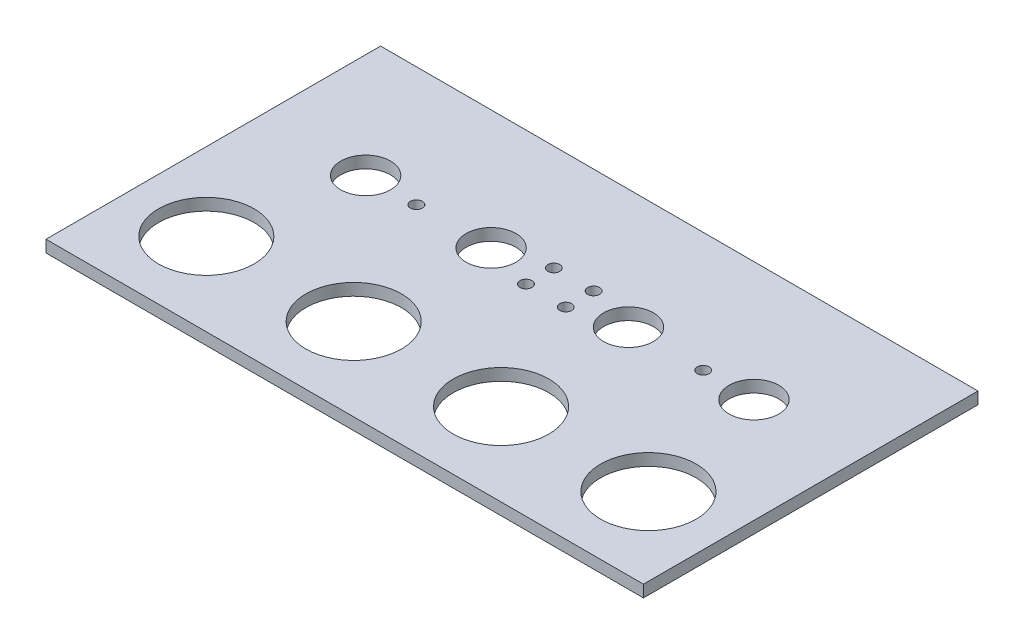
ISO-10303-21;
HEADER;
FILE_DESCRIPTION(('STEP AP214'),'2;1');
FILE_NAME('part.step','',(''),(''),'','','');
FILE_SCHEMA(('AUTOMOTIVE_DESIGN { 1 0 10303 214 1 1 1 1 }'));
ENDSEC;
DATA;
#1=APPLICATION_CONTEXT('core data for automotive mechanical design processes');
#2=APPLICATION_PROTOCOL_DEFINITION('international standard','automotive_design',2000,#1);
#3=PRODUCT_CONTEXT('',#1,'mechanical');
#4=PRODUCT('Part','Part','',(#3));
#5=PRODUCT_RELATED_PRODUCT_CATEGORY('part','',(#4));
#6=PRODUCT_DEFINITION_FORMATION('','',#4);
#7=PRODUCT_DEFINITION_CONTEXT('part definition',#1,'design');
#8=PRODUCT_DEFINITION('design','',#6,#7);
#9=PRODUCT_DEFINITION_SHAPE('','',#8);
#10=(LENGTH_UNIT() NAMED_UNIT(*) SI_UNIT(.MILLI.,.METRE.));
#11=(NAMED_UNIT(*) PLANE_ANGLE_UNIT() SI_UNIT($,.RADIAN.));
#12=(NAMED_UNIT(*) SI_UNIT($,.STERADIAN.) SOLID_ANGLE_UNIT());
#13=UNCERTAINTY_MEASURE_WITH_UNIT(LENGTH_MEASURE(1.E-05),#10,'distance_accuracy_value','');
#14=(GEOMETRIC_REPRESENTATION_CONTEXT(3) GLOBAL_UNCERTAINTY_ASSIGNED_CONTEXT((#13)) GLOBAL_UNIT_ASSIGNED_CONTEXT((#10,
#11,#12)) REPRESENTATION_CONTEXT('',''));
#15=CARTESIAN_POINT('',(0.,0.,0.));
#16=DIRECTION('',(0.,0.,1.));
#17=DIRECTION('',(1.,0.,0.));
#18=AXIS2_PLACEMENT_3D('',#15,#16,#17);
#19=CARTESIAN_POINT('',(-60.5686566500887,-3.,-45.286639095357));
#20=DIRECTION('',(-1.,0.,0.));
#21=DIRECTION('',(0.,0.,1.));
#22=AXIS2_PLACEMENT_3D('',#19,#20,#21);
#23=PLANE('',#22);
#24=DIRECTION('',(0.,0.,1.));
#25=VECTOR('',#24,1.);
#26=CARTESIAN_POINT('',(-60.5686566500887,0.,-45.286639095357));
#27=LINE('',#26,#25);
#28=CARTESIAN_POINT('',(-60.5686566500887,0.,-45.286639095357));
#29=VERTEX_POINT('',#28);
#30=CARTESIAN_POINT('',(-60.5686566500886,0.,38.713360904643));
#31=VERTEX_POINT('',#30);
#32=EDGE_CURVE('E104',#29,#31,#27,.T.);
#33=ORIENTED_EDGE('',*,*,#32,.F.);
#34=DIRECTION('',(0.,1.,0.));
#35=VECTOR('',#34,1.);
#36=CARTESIAN_POINT('',(-60.5686566500887,-3.,-45.286639095357));
#37=LINE('',#36,#35);
#38=CARTESIAN_POINT('',(-60.5686566500887,-3.,-45.286639095357));
#39=VERTEX_POINT('',#38);
#40=EDGE_CURVE('E11',#39,#29,#37,.T.);
#41=ORIENTED_EDGE('',*,*,#40,.F.);
#42=DIRECTION('',(0.,0.,1.));
#43=VECTOR('',#42,1.);
#44=CARTESIAN_POINT('',(-60.5686566500887,-3.,-45.286639095357));
#45=LINE('',#44,#43);
#46=CARTESIAN_POINT('',(-60.5686566500886,-3.,38.713360904643));
#47=VERTEX_POINT('',#46);
#48=EDGE_CURVE('E97',#39,#47,#45,.T.);
#49=ORIENTED_EDGE('',*,*,#48,.T.);
#50=DIRECTION('',(0.,1.,0.));
#51=VECTOR('',#50,1.);
#52=CARTESIAN_POINT('',(-60.5686566500886,-3.,38.713360904643));
#53=LINE('',#52,#51);
#54=EDGE_CURVE('E42',#47,#31,#53,.T.);
#55=ORIENTED_EDGE('',*,*,#54,.T.);
#56=EDGE_LOOP('',(#33,#41,#49,#55));
#57=FACE_BOUND('',#56,.T.);
#58=ADVANCED_FACE('F39',(#57),#23,.T.);
#59=CARTESIAN_POINT('',(-60.5686566500887,-3.,-45.286639095357));
#60=DIRECTION('',(0.,0.,-1.));
#61=DIRECTION('',(-1.,0.,0.));
#62=AXIS2_PLACEMENT_3D('',#59,#60,#61);
#63=PLANE('',#62);
#64=DIRECTION('',(-1.,0.,0.));
#65=VECTOR('',#64,1.);
#66=CARTESIAN_POINT('',(-60.5686566500887,0.,-45.286639095357));
#67=LINE('',#66,#65);
#68=CARTESIAN_POINT('',(89.4313433499113,0.,-45.286639095357));
#69=VERTEX_POINT('',#68);
#70=EDGE_CURVE('E99',#69,#29,#67,.T.);
#71=ORIENTED_EDGE('',*,*,#70,.F.);
#72=DIRECTION('',(0.,1.,0.));
#73=VECTOR('',#72,1.);
#74=CARTESIAN_POINT('',(89.4313433499113,-3.,-45.286639095357));
#75=LINE('',#74,#73);
#76=CARTESIAN_POINT('',(89.4313433499113,-3.,-45.286639095357));
#77=VERTEX_POINT('',#76);
#78=EDGE_CURVE('E48',#77,#69,#75,.T.);
#79=ORIENTED_EDGE('',*,*,#78,.F.);
#80=DIRECTION('',(-1.,0.,0.));
#81=VECTOR('',#80,1.);
#82=CARTESIAN_POINT('',(-60.5686566500887,-3.,-45.286639095357));
#83=LINE('',#82,#81);
#84=EDGE_CURVE('E94',#77,#39,#83,.T.);
#85=ORIENTED_EDGE('',*,*,#84,.T.);
#86=ORIENTED_EDGE('',*,*,#40,.T.);
#87=EDGE_LOOP('',(#71,#79,#85,#86));
#88=FACE_BOUND('',#87,.T.);
#89=ADVANCED_FACE('F115',(#88),#63,.T.);
#90=CARTESIAN_POINT('',(89.4313433499113,-3.,-45.286639095357));
#91=DIRECTION('',(1.,0.,0.));
#92=DIRECTION('',(0.,0.,-1.));
#93=AXIS2_PLACEMENT_3D('',#90,#91,#92);
#94=PLANE('',#93);
#95=DIRECTION('',(0.,0.,-1.));
#96=VECTOR('',#95,1.);
#97=CARTESIAN_POINT('',(89.4313433499113,0.,-45.286639095357));
#98=LINE('',#97,#96);
#99=CARTESIAN_POINT('',(89.4313433499113,0.,38.713360904643));
#100=VERTEX_POINT('',#99);
#101=EDGE_CURVE('E89',#100,#69,#98,.T.);
#102=ORIENTED_EDGE('',*,*,#101,.F.);
#103=DIRECTION('',(0.,1.,0.));
#104=VECTOR('',#103,1.);
#105=CARTESIAN_POINT('',(89.4313433499113,-3.,38.713360904643));
#106=LINE('',#105,#104);
#107=CARTESIAN_POINT('',(89.4313433499113,-3.,38.713360904643));
#108=VERTEX_POINT('',#107);
#109=EDGE_CURVE('E84',#108,#100,#106,.T.);
#110=ORIENTED_EDGE('',*,*,#109,.F.);
#111=DIRECTION('',(0.,0.,-1.));
#112=VECTOR('',#111,1.);
#113=CARTESIAN_POINT('',(89.4313433499113,-3.,-45.286639095357));
#114=LINE('',#113,#112);
#115=EDGE_CURVE('E87',#108,#77,#114,.T.);
#116=ORIENTED_EDGE('',*,*,#115,.T.);
#117=ORIENTED_EDGE('',*,*,#78,.T.);
#118=EDGE_LOOP('',(#102,#110,#116,#117));
#119=FACE_BOUND('',#118,.T.);
#120=ADVANCED_FACE('F86',(#119),#94,.T.);
#121=CARTESIAN_POINT('',(-60.5686566500886,-3.,38.713360904643));
#122=DIRECTION('',(0.,0.,1.));
#123=DIRECTION('',(1.,0.,0.));
#124=AXIS2_PLACEMENT_3D('',#121,#122,#123);
#125=PLANE('',#124);
#126=DIRECTION('',(1.,0.,0.));
#127=VECTOR('',#126,1.);
#128=CARTESIAN_POINT('',(-60.5686566500886,0.,38.713360904643));
#129=LINE('',#128,#127);
#130=EDGE_CURVE('E107',#31,#100,#129,.T.);
#131=ORIENTED_EDGE('',*,*,#130,.F.);
#132=ORIENTED_EDGE('',*,*,#54,.F.);
#133=DIRECTION('',(1.,0.,0.));
#134=VECTOR('',#133,1.);
#135=CARTESIAN_POINT('',(-60.5686566500886,-3.,38.713360904643));
#136=LINE('',#135,#134);
#137=EDGE_CURVE('E93',#47,#108,#136,.T.);
#138=ORIENTED_EDGE('',*,*,#137,.T.);
#139=ORIENTED_EDGE('',*,*,#109,.T.);
#140=EDGE_LOOP('',(#131,#132,#138,#139));
#141=FACE_BOUND('',#140,.T.);
#142=ADVANCED_FACE('F96',(#141),#125,.T.);
#143=CARTESIAN_POINT('',(0.,-3.,0.));
#144=DIRECTION('',(0.,1.,0.));
#145=DIRECTION('',(0.,0.,1.));
#146=AXIS2_PLACEMENT_3D('',#143,#144,#145);
#147=PLANE('',#146);
#148=CARTESIAN_POINT('',(63.1813433499114,-3.,-15.286639095357));
#149=DIRECTION('',(0.,1.,0.));
#150=DIRECTION('',(0.,0.,-1.));
#151=AXIS2_PLACEMENT_3D('',#148,#149,#150);
#152=CIRCLE('',#151,6.25);
#153=CARTESIAN_POINT('',(63.1813433499114,-3.,-21.536639095357));
#154=VERTEX_POINT('',#153);
#155=EDGE_CURVE('E196',#154,#154,#152,.T.);
#156=ORIENTED_EDGE('',*,*,#155,.T.);
#157=EDGE_LOOP('',(#156));
#158=FACE_BOUND('',#157,.T.);
#159=CARTESIAN_POINT('',(50.4313433499113,-3.,-15.286639095357));
#160=DIRECTION('',(0.,1.,0.));
#161=DIRECTION('',(0.,0.,-1.));
#162=AXIS2_PLACEMENT_3D('',#159,#160,#161);
#163=CIRCLE('',#162,1.5);
#164=CARTESIAN_POINT('',(50.4313433499113,-3.,-16.786639095357));
#165=VERTEX_POINT('',#164);
#166=EDGE_CURVE('E204',#165,#165,#163,.T.);
#167=ORIENTED_EDGE('',*,*,#166,.T.);
#168=EDGE_LOOP('',(#167));
#169=FACE_BOUND('',#168,.T.);
#170=CARTESIAN_POINT('',(31.6813433499113,-3.,-15.286639095357));
#171=DIRECTION('',(0.,1.,0.));
#172=DIRECTION('',(0.,0.,-1.));
#173=AXIS2_PLACEMENT_3D('',#170,#171,#172);
#174=CIRCLE('',#173,6.25000000000001);
#175=CARTESIAN_POINT('',(31.6813433499113,-3.,-21.536639095357));
#176=VERTEX_POINT('',#175);
#177=EDGE_CURVE('E210',#176,#176,#174,.T.);
#178=ORIENTED_EDGE('',*,*,#177,.T.);
#179=EDGE_LOOP('',(#178));
#180=FACE_BOUND('',#179,.T.);
#181=CARTESIAN_POINT('',(19.4313433499114,-3.,-18.786639095357));
#182=DIRECTION('',(0.,1.,0.));
#183=DIRECTION('',(0.,0.,-1.));
#184=AXIS2_PLACEMENT_3D('',#181,#182,#183);
#185=CIRCLE('',#184,1.5);
#186=CARTESIAN_POINT('',(19.4313433499114,-3.,-20.286639095357));
#187=VERTEX_POINT('',#186);
#188=EDGE_CURVE('E216',#187,#187,#185,.T.);
#189=ORIENTED_EDGE('',*,*,#188,.T.);
#190=EDGE_LOOP('',(#189));
#191=FACE_BOUND('',#190,.T.);
#192=CARTESIAN_POINT('',(19.4313433499114,-3.,-11.786639095357));
#193=DIRECTION('',(0.,1.,0.));
#194=DIRECTION('',(0.,0.,-1.));
#195=AXIS2_PLACEMENT_3D('',#192,#193,#194);
#196=CIRCLE('',#195,1.5);
#197=CARTESIAN_POINT('',(19.4313433499114,-3.,-13.286639095357));
#198=VERTEX_POINT('',#197);
#199=EDGE_CURVE('E222',#198,#198,#196,.T.);
#200=ORIENTED_EDGE('',*,*,#199,.T.);
#201=EDGE_LOOP('',(#200));
#202=FACE_BOUND('',#201,.T.);
#203=CARTESIAN_POINT('',(32.9313433499114,-3.,17.963360904643));
#204=DIRECTION('',(0.,1.,0.));
#205=DIRECTION('',(0.,0.,-1.));
#206=AXIS2_PLACEMENT_3D('',#203,#204,#205);
#207=CIRCLE('',#206,12.);
#208=CARTESIAN_POINT('',(32.9313433499114,-3.,5.96336090464301));
#209=VERTEX_POINT('',#208);
#210=EDGE_CURVE('E228',#209,#209,#207,.T.);
#211=ORIENTED_EDGE('',*,*,#210,.T.);
#212=EDGE_LOOP('',(#211));
#213=FACE_BOUND('',#212,.T.);
#214=CARTESIAN_POINT('',(69.9313433499114,-3.,17.963360904643));
#215=DIRECTION('',(0.,1.,0.));
#216=DIRECTION('',(0.,0.,-1.));
#217=AXIS2_PLACEMENT_3D('',#214,#215,#216);
#218=CIRCLE('',#217,12.);
#219=CARTESIAN_POINT('',(69.9313433499114,-3.,5.96336090464299));
#220=VERTEX_POINT('',#219);
#221=EDGE_CURVE('E234',#220,#220,#218,.T.);
#222=ORIENTED_EDGE('',*,*,#221,.T.);
#223=EDGE_LOOP('',(#222));
#224=FACE_BOUND('',#223,.T.);
#225=CARTESIAN_POINT('',(9.43134334991135,-3.,-11.786639095357));
#226=DIRECTION('',(0.,1.,0.));
#227=DIRECTION('',(0.,0.,1.));
#228=AXIS2_PLACEMENT_3D('',#225,#226,#227);
#229=CIRCLE('',#228,1.5);
#230=CARTESIAN_POINT('',(9.43134334991135,-3.,-10.286639095357));
#231=VERTEX_POINT('',#230);
#232=EDGE_CURVE('E240',#231,#231,#229,.T.);
#233=ORIENTED_EDGE('',*,*,#232,.T.);
#234=EDGE_LOOP('',(#233));
#235=FACE_BOUND('',#234,.T.);
#236=CARTESIAN_POINT('',(9.43134334991135,-3.,-18.786639095357));
#237=DIRECTION('',(0.,1.,0.));
#238=DIRECTION('',(0.,0.,1.));
#239=AXIS2_PLACEMENT_3D('',#236,#237,#238);
#240=CIRCLE('',#239,1.5);
#241=CARTESIAN_POINT('',(9.43134334991135,-3.,-17.286639095357));
#242=VERTEX_POINT('',#241);
#243=EDGE_CURVE('E246',#242,#242,#240,.T.);
#244=ORIENTED_EDGE('',*,*,#243,.T.);
#245=EDGE_LOOP('',(#244));
#246=FACE_BOUND('',#245,.T.);
#247=CARTESIAN_POINT('',(-2.81865665008865,-3.,-15.286639095357));
#248=DIRECTION('',(0.,1.,0.));
#249=DIRECTION('',(0.,0.,1.));
#250=AXIS2_PLACEMENT_3D('',#247,#248,#249);
#251=CIRCLE('',#250,6.25);
#252=CARTESIAN_POINT('',(-2.81865665008865,-3.,-9.03663909535699));
#253=VERTEX_POINT('',#252);
#254=EDGE_CURVE('E252',#253,#253,#251,.T.);
#255=ORIENTED_EDGE('',*,*,#254,.T.);
#256=EDGE_LOOP('',(#255));
#257=FACE_BOUND('',#256,.T.);
#258=CARTESIAN_POINT('',(-21.5686566500886,-3.,-15.286639095357));
#259=DIRECTION('',(0.,1.,0.));
#260=DIRECTION('',(0.,0.,1.));
#261=AXIS2_PLACEMENT_3D('',#258,#259,#260);
#262=CIRCLE('',#261,1.5);
#263=CARTESIAN_POINT('',(-21.5686566500886,-3.,-13.786639095357));
#264=VERTEX_POINT('',#263);
#265=EDGE_CURVE('E258',#264,#264,#262,.T.);
#266=ORIENTED_EDGE('',*,*,#265,.T.);
#267=EDGE_LOOP('',(#266));
#268=FACE_BOUND('',#267,.T.);
#269=CARTESIAN_POINT('',(-4.06865665008865,-3.,17.963360904643));
#270=DIRECTION('',(0.,1.,0.));
#271=DIRECTION('',(0.,0.,1.));
#272=AXIS2_PLACEMENT_3D('',#269,#270,#271);
#273=CIRCLE('',#272,12.);
#274=CARTESIAN_POINT('',(-4.06865665008865,-3.,29.963360904643));
#275=VERTEX_POINT('',#274);
#276=EDGE_CURVE('E264',#275,#275,#273,.T.);
#277=ORIENTED_EDGE('',*,*,#276,.T.);
#278=EDGE_LOOP('',(#277));
#279=FACE_BOUND('',#278,.T.);
#280=CARTESIAN_POINT('',(-34.3186566500887,-3.,-15.286639095357));
#281=DIRECTION('',(0.,1.,0.));
#282=DIRECTION('',(0.,0.,1.));
#283=AXIS2_PLACEMENT_3D('',#280,#281,#282);
#284=CIRCLE('',#283,6.25);
#285=CARTESIAN_POINT('',(-34.3186566500887,-3.,-9.03663909535699));
#286=VERTEX_POINT('',#285);
#287=EDGE_CURVE('E270',#286,#286,#284,.T.);
#288=ORIENTED_EDGE('',*,*,#287,.T.);
#289=EDGE_LOOP('',(#288));
#290=FACE_BOUND('',#289,.T.);
#291=CARTESIAN_POINT('',(-41.0686566500886,-3.,17.963360904643));
#292=DIRECTION('',(0.,1.,0.));
#293=DIRECTION('',(0.,0.,1.));
#294=AXIS2_PLACEMENT_3D('',#291,#292,#293);
#295=CIRCLE('',#294,12.);
#296=CARTESIAN_POINT('',(-41.0686566500886,-3.,29.963360904643));
#297=VERTEX_POINT('',#296);
#298=EDGE_CURVE('E108',#297,#297,#295,.T.);
#299=ORIENTED_EDGE('',*,*,#298,.T.);
#300=EDGE_LOOP('',(#299));
#301=FACE_BOUND('',#300,.T.);
#302=ORIENTED_EDGE('',*,*,#48,.F.);
#303=ORIENTED_EDGE('',*,*,#84,.F.);
#304=ORIENTED_EDGE('',*,*,#115,.F.);
#305=ORIENTED_EDGE('',*,*,#137,.F.);
#306=EDGE_LOOP('',(#302,#303,#304,#305));
#307=FACE_BOUND('',#306,.T.);
#308=ADVANCED_FACE('F92',(#158,#169,#180,#191,#202,#213,#224,#235,#246,#257,#268,#279,#290,#301,
#307),#147,.F.);
#309=CARTESIAN_POINT('',(0.,0.,0.));
#310=DIRECTION('',(0.,1.,0.));
#311=DIRECTION('',(0.,0.,1.));
#312=AXIS2_PLACEMENT_3D('',#309,#310,#311);
#313=PLANE('',#312);
#314=CARTESIAN_POINT('',(63.1813433499114,0.,-15.286639095357));
#315=DIRECTION('',(0.,1.,0.));
#316=DIRECTION('',(0.,0.,-1.));
#317=AXIS2_PLACEMENT_3D('',#314,#315,#316);
#318=CIRCLE('',#317,6.25);
#319=CARTESIAN_POINT('',(63.1813433499114,0.,-21.536639095357));
#320=VERTEX_POINT('',#319);
#321=EDGE_CURVE('E199',#320,#320,#318,.T.);
#322=ORIENTED_EDGE('',*,*,#321,.F.);
#323=EDGE_LOOP('',(#322));
#324=FACE_BOUND('',#323,.T.);
#325=CARTESIAN_POINT('',(50.4313433499113,0.,-15.286639095357));
#326=DIRECTION('',(0.,1.,0.));
#327=DIRECTION('',(0.,0.,-1.));
#328=AXIS2_PLACEMENT_3D('',#325,#326,#327);
#329=CIRCLE('',#328,1.5);
#330=CARTESIAN_POINT('',(50.4313433499113,0.,-16.786639095357));
#331=VERTEX_POINT('',#330);
#332=EDGE_CURVE('E201',#331,#331,#329,.T.);
#333=ORIENTED_EDGE('',*,*,#332,.F.);
#334=EDGE_LOOP('',(#333));
#335=FACE_BOUND('',#334,.T.);
#336=CARTESIAN_POINT('',(31.6813433499113,0.,-15.286639095357));
#337=DIRECTION('',(0.,1.,0.));
#338=DIRECTION('',(0.,0.,-1.));
#339=AXIS2_PLACEMENT_3D('',#336,#337,#338);
#340=CIRCLE('',#339,6.25000000000001);
#341=CARTESIAN_POINT('',(31.6813433499113,0.,-21.536639095357));
#342=VERTEX_POINT('',#341);
#343=EDGE_CURVE('E207',#342,#342,#340,.T.);
#344=ORIENTED_EDGE('',*,*,#343,.F.);
#345=EDGE_LOOP('',(#344));
#346=FACE_BOUND('',#345,.T.);
#347=CARTESIAN_POINT('',(19.4313433499114,0.,-18.786639095357));
#348=DIRECTION('',(0.,1.,0.));
#349=DIRECTION('',(0.,0.,-1.));
#350=AXIS2_PLACEMENT_3D('',#347,#348,#349);
#351=CIRCLE('',#350,1.5);
#352=CARTESIAN_POINT('',(19.4313433499114,0.,-20.286639095357));
#353=VERTEX_POINT('',#352);
#354=EDGE_CURVE('E213',#353,#353,#351,.T.);
#355=ORIENTED_EDGE('',*,*,#354,.F.);
#356=EDGE_LOOP('',(#355));
#357=FACE_BOUND('',#356,.T.);
#358=CARTESIAN_POINT('',(19.4313433499114,0.,-11.786639095357));
#359=DIRECTION('',(0.,1.,0.));
#360=DIRECTION('',(0.,0.,-1.));
#361=AXIS2_PLACEMENT_3D('',#358,#359,#360);
#362=CIRCLE('',#361,1.5);
#363=CARTESIAN_POINT('',(19.4313433499114,0.,-13.286639095357));
#364=VERTEX_POINT('',#363);
#365=EDGE_CURVE('E219',#364,#364,#362,.T.);
#366=ORIENTED_EDGE('',*,*,#365,.F.);
#367=EDGE_LOOP('',(#366));
#368=FACE_BOUND('',#367,.T.);
#369=CARTESIAN_POINT('',(32.9313433499114,0.,17.963360904643));
#370=DIRECTION('',(0.,1.,0.));
#371=DIRECTION('',(0.,0.,-1.));
#372=AXIS2_PLACEMENT_3D('',#369,#370,#371);
#373=CIRCLE('',#372,12.);
#374=CARTESIAN_POINT('',(32.9313433499114,0.,5.96336090464301));
#375=VERTEX_POINT('',#374);
#376=EDGE_CURVE('E225',#375,#375,#373,.T.);
#377=ORIENTED_EDGE('',*,*,#376,.F.);
#378=EDGE_LOOP('',(#377));
#379=FACE_BOUND('',#378,.T.);
#380=CARTESIAN_POINT('',(69.9313433499114,0.,17.963360904643));
#381=DIRECTION('',(0.,1.,0.));
#382=DIRECTION('',(0.,0.,-1.));
#383=AXIS2_PLACEMENT_3D('',#380,#381,#382);
#384=CIRCLE('',#383,12.);
#385=CARTESIAN_POINT('',(69.9313433499114,0.,5.96336090464299));
#386=VERTEX_POINT('',#385);
#387=EDGE_CURVE('E231',#386,#386,#384,.T.);
#388=ORIENTED_EDGE('',*,*,#387,.F.);
#389=EDGE_LOOP('',(#388));
#390=FACE_BOUND('',#389,.T.);
#391=CARTESIAN_POINT('',(9.43134334991135,0.,-11.786639095357));
#392=DIRECTION('',(0.,1.,0.));
#393=DIRECTION('',(0.,0.,1.));
#394=AXIS2_PLACEMENT_3D('',#391,#392,#393);
#395=CIRCLE('',#394,1.5);
#396=CARTESIAN_POINT('',(9.43134334991135,0.,-10.286639095357));
#397=VERTEX_POINT('',#396);
#398=EDGE_CURVE('E237',#397,#397,#395,.T.);
#399=ORIENTED_EDGE('',*,*,#398,.F.);
#400=EDGE_LOOP('',(#399));
#401=FACE_BOUND('',#400,.T.);
#402=CARTESIAN_POINT('',(9.43134334991135,0.,-18.786639095357));
#403=DIRECTION('',(0.,1.,0.));
#404=DIRECTION('',(0.,0.,1.));
#405=AXIS2_PLACEMENT_3D('',#402,#403,#404);
#406=CIRCLE('',#405,1.5);
#407=CARTESIAN_POINT('',(9.43134334991135,0.,-17.286639095357));
#408=VERTEX_POINT('',#407);
#409=EDGE_CURVE('E243',#408,#408,#406,.T.);
#410=ORIENTED_EDGE('',*,*,#409,.F.);
#411=EDGE_LOOP('',(#410));
#412=FACE_BOUND('',#411,.T.);
#413=CARTESIAN_POINT('',(-2.81865665008865,0.,-15.286639095357));
#414=DIRECTION('',(0.,1.,0.));
#415=DIRECTION('',(0.,0.,1.));
#416=AXIS2_PLACEMENT_3D('',#413,#414,#415);
#417=CIRCLE('',#416,6.25);
#418=CARTESIAN_POINT('',(-2.81865665008865,0.,-9.03663909535699));
#419=VERTEX_POINT('',#418);
#420=EDGE_CURVE('E249',#419,#419,#417,.T.);
#421=ORIENTED_EDGE('',*,*,#420,.F.);
#422=EDGE_LOOP('',(#421));
#423=FACE_BOUND('',#422,.T.);
#424=CARTESIAN_POINT('',(-21.5686566500886,0.,-15.286639095357));
#425=DIRECTION('',(0.,1.,0.));
#426=DIRECTION('',(0.,0.,1.));
#427=AXIS2_PLACEMENT_3D('',#424,#425,#426);
#428=CIRCLE('',#427,1.5);
#429=CARTESIAN_POINT('',(-21.5686566500886,0.,-13.786639095357));
#430=VERTEX_POINT('',#429);
#431=EDGE_CURVE('E255',#430,#430,#428,.T.);
#432=ORIENTED_EDGE('',*,*,#431,.F.);
#433=EDGE_LOOP('',(#432));
#434=FACE_BOUND('',#433,.T.);
#435=CARTESIAN_POINT('',(-4.06865665008865,0.,17.963360904643));
#436=DIRECTION('',(0.,1.,0.));
#437=DIRECTION('',(0.,0.,1.));
#438=AXIS2_PLACEMENT_3D('',#435,#436,#437);
#439=CIRCLE('',#438,12.);
#440=CARTESIAN_POINT('',(-4.06865665008865,0.,29.963360904643));
#441=VERTEX_POINT('',#440);
#442=EDGE_CURVE('E261',#441,#441,#439,.T.);
#443=ORIENTED_EDGE('',*,*,#442,.F.);
#444=EDGE_LOOP('',(#443));
#445=FACE_BOUND('',#444,.T.);
#446=CARTESIAN_POINT('',(-34.3186566500887,0.,-15.286639095357));
#447=DIRECTION('',(0.,1.,0.));
#448=DIRECTION('',(0.,0.,1.));
#449=AXIS2_PLACEMENT_3D('',#446,#447,#448);
#450=CIRCLE('',#449,6.25);
#451=CARTESIAN_POINT('',(-34.3186566500887,0.,-9.03663909535699));
#452=VERTEX_POINT('',#451);
#453=EDGE_CURVE('E267',#452,#452,#450,.T.);
#454=ORIENTED_EDGE('',*,*,#453,.F.);
#455=EDGE_LOOP('',(#454));
#456=FACE_BOUND('',#455,.T.);
#457=CARTESIAN_POINT('',(-41.0686566500886,0.,17.963360904643));
#458=DIRECTION('',(0.,1.,0.));
#459=DIRECTION('',(0.,0.,1.));
#460=AXIS2_PLACEMENT_3D('',#457,#458,#459);
#461=CIRCLE('',#460,12.);
#462=CARTESIAN_POINT('',(-41.0686566500886,0.,29.963360904643));
#463=VERTEX_POINT('',#462);
#464=EDGE_CURVE('E273',#463,#463,#461,.T.);
#465=ORIENTED_EDGE('',*,*,#464,.F.);
#466=EDGE_LOOP('',(#465));
#467=FACE_BOUND('',#466,.T.);
#468=ORIENTED_EDGE('',*,*,#32,.T.);
#469=ORIENTED_EDGE('',*,*,#130,.T.);
#470=ORIENTED_EDGE('',*,*,#101,.T.);
#471=ORIENTED_EDGE('',*,*,#70,.T.);
#472=EDGE_LOOP('',(#468,#469,#470,#471));
#473=FACE_BOUND('',#472,.T.);
#474=ADVANCED_FACE('F114',(#324,#335,#346,#357,#368,#379,#390,#401,#412,#423,#434,#445,#456,
#467,#473),#313,.T.);
#475=CARTESIAN_POINT('',(-41.0686566500886,-3.,17.963360904643));
#476=DIRECTION('',(0.,1.,0.));
#477=DIRECTION('',(0.,0.,1.));
#478=AXIS2_PLACEMENT_3D('',#475,#476,#477);
#479=CYLINDRICAL_SURFACE('',#478,12.);
#480=ORIENTED_EDGE('',*,*,#298,.F.);
#481=EDGE_LOOP('',(#480));
#482=FACE_BOUND('',#481,.T.);
#483=ORIENTED_EDGE('',*,*,#464,.T.);
#484=EDGE_LOOP('',(#483));
#485=FACE_BOUND('',#484,.T.);
#486=ADVANCED_FACE('F133',(#482,#485),#479,.F.);
#487=CARTESIAN_POINT('',(-34.3186566500887,-3.,-15.286639095357));
#488=DIRECTION('',(0.,1.,0.));
#489=DIRECTION('',(0.,0.,1.));
#490=AXIS2_PLACEMENT_3D('',#487,#488,#489);
#491=CYLINDRICAL_SURFACE('',#490,6.25);
#492=ORIENTED_EDGE('',*,*,#287,.F.);
#493=EDGE_LOOP('',(#492));
#494=FACE_BOUND('',#493,.T.);
#495=ORIENTED_EDGE('',*,*,#453,.T.);
#496=EDGE_LOOP('',(#495));
#497=FACE_BOUND('',#496,.T.);
#498=ADVANCED_FACE('F140',(#494,#497),#491,.F.);
#499=CARTESIAN_POINT('',(-4.06865665008865,-3.,17.963360904643));
#500=DIRECTION('',(0.,1.,0.));
#501=DIRECTION('',(0.,0.,1.));
#502=AXIS2_PLACEMENT_3D('',#499,#500,#501);
#503=CYLINDRICAL_SURFACE('',#502,12.);
#504=ORIENTED_EDGE('',*,*,#276,.F.);
#505=EDGE_LOOP('',(#504));
#506=FACE_BOUND('',#505,.T.);
#507=ORIENTED_EDGE('',*,*,#442,.T.);
#508=EDGE_LOOP('',(#507));
#509=FACE_BOUND('',#508,.T.);
#510=ADVANCED_FACE('F144',(#506,#509),#503,.F.);
#511=CARTESIAN_POINT('',(-21.5686566500886,-3.,-15.286639095357));
#512=DIRECTION('',(0.,1.,0.));
#513=DIRECTION('',(0.,0.,1.));
#514=AXIS2_PLACEMENT_3D('',#511,#512,#513);
#515=CYLINDRICAL_SURFACE('',#514,1.5);
#516=ORIENTED_EDGE('',*,*,#265,.F.);
#517=EDGE_LOOP('',(#516));
#518=FACE_BOUND('',#517,.T.);
#519=ORIENTED_EDGE('',*,*,#431,.T.);
#520=EDGE_LOOP('',(#519));
#521=FACE_BOUND('',#520,.T.);
#522=ADVANCED_FACE('F148',(#518,#521),#515,.F.);
#523=CARTESIAN_POINT('',(-2.81865665008865,-3.,-15.286639095357));
#524=DIRECTION('',(0.,1.,0.));
#525=DIRECTION('',(0.,0.,1.));
#526=AXIS2_PLACEMENT_3D('',#523,#524,#525);
#527=CYLINDRICAL_SURFACE('',#526,6.25);
#528=ORIENTED_EDGE('',*,*,#254,.F.);
#529=EDGE_LOOP('',(#528));
#530=FACE_BOUND('',#529,.T.);
#531=ORIENTED_EDGE('',*,*,#420,.T.);
#532=EDGE_LOOP('',(#531));
#533=FACE_BOUND('',#532,.T.);
#534=ADVANCED_FACE('F152',(#530,#533),#527,.F.);
#535=CARTESIAN_POINT('',(9.43134334991135,-3.,-18.786639095357));
#536=DIRECTION('',(0.,1.,0.));
#537=DIRECTION('',(0.,0.,1.));
#538=AXIS2_PLACEMENT_3D('',#535,#536,#537);
#539=CYLINDRICAL_SURFACE('',#538,1.5);
#540=ORIENTED_EDGE('',*,*,#243,.F.);
#541=EDGE_LOOP('',(#540));
#542=FACE_BOUND('',#541,.T.);
#543=ORIENTED_EDGE('',*,*,#409,.T.);
#544=EDGE_LOOP('',(#543));
#545=FACE_BOUND('',#544,.T.);
#546=ADVANCED_FACE('F156',(#542,#545),#539,.F.);
#547=CARTESIAN_POINT('',(9.43134334991135,-3.,-11.786639095357));
#548=DIRECTION('',(0.,1.,0.));
#549=DIRECTION('',(0.,0.,1.));
#550=AXIS2_PLACEMENT_3D('',#547,#548,#549);
#551=CYLINDRICAL_SURFACE('',#550,1.5);
#552=ORIENTED_EDGE('',*,*,#232,.F.);
#553=EDGE_LOOP('',(#552));
#554=FACE_BOUND('',#553,.T.);
#555=ORIENTED_EDGE('',*,*,#398,.T.);
#556=EDGE_LOOP('',(#555));
#557=FACE_BOUND('',#556,.T.);
#558=ADVANCED_FACE('F160',(#554,#557),#551,.F.);
#559=CARTESIAN_POINT('',(69.9313433499114,-3.,17.963360904643));
#560=DIRECTION('',(0.,1.,0.));
#561=DIRECTION('',(0.,0.,1.));
#562=AXIS2_PLACEMENT_3D('',#559,#560,#561);
#563=CYLINDRICAL_SURFACE('',#562,12.);
#564=ORIENTED_EDGE('',*,*,#221,.F.);
#565=EDGE_LOOP('',(#564));
#566=FACE_BOUND('',#565,.T.);
#567=ORIENTED_EDGE('',*,*,#387,.T.);
#568=EDGE_LOOP('',(#567));
#569=FACE_BOUND('',#568,.T.);
#570=ADVANCED_FACE('F164',(#566,#569),#563,.F.);
#571=CARTESIAN_POINT('',(32.9313433499114,-3.,17.963360904643));
#572=DIRECTION('',(0.,1.,0.));
#573=DIRECTION('',(0.,0.,1.));
#574=AXIS2_PLACEMENT_3D('',#571,#572,#573);
#575=CYLINDRICAL_SURFACE('',#574,12.);
#576=ORIENTED_EDGE('',*,*,#210,.F.);
#577=EDGE_LOOP('',(#576));
#578=FACE_BOUND('',#577,.T.);
#579=ORIENTED_EDGE('',*,*,#376,.T.);
#580=EDGE_LOOP('',(#579));
#581=FACE_BOUND('',#580,.T.);
#582=ADVANCED_FACE('F168',(#578,#581),#575,.F.);
#583=CARTESIAN_POINT('',(19.4313433499114,-3.,-11.786639095357));
#584=DIRECTION('',(0.,1.,0.));
#585=DIRECTION('',(0.,0.,1.));
#586=AXIS2_PLACEMENT_3D('',#583,#584,#585);
#587=CYLINDRICAL_SURFACE('',#586,1.5);
#588=ORIENTED_EDGE('',*,*,#199,.F.);
#589=EDGE_LOOP('',(#588));
#590=FACE_BOUND('',#589,.T.);
#591=ORIENTED_EDGE('',*,*,#365,.T.);
#592=EDGE_LOOP('',(#591));
#593=FACE_BOUND('',#592,.T.);
#594=ADVANCED_FACE('F172',(#590,#593),#587,.F.);
#595=CARTESIAN_POINT('',(19.4313433499114,-3.,-18.786639095357));
#596=DIRECTION('',(0.,1.,0.));
#597=DIRECTION('',(0.,0.,1.));
#598=AXIS2_PLACEMENT_3D('',#595,#596,#597);
#599=CYLINDRICAL_SURFACE('',#598,1.5);
#600=ORIENTED_EDGE('',*,*,#188,.F.);
#601=EDGE_LOOP('',(#600));
#602=FACE_BOUND('',#601,.T.);
#603=ORIENTED_EDGE('',*,*,#354,.T.);
#604=EDGE_LOOP('',(#603));
#605=FACE_BOUND('',#604,.T.);
#606=ADVANCED_FACE('F176',(#602,#605),#599,.F.);
#607=CARTESIAN_POINT('',(31.6813433499113,-3.,-15.286639095357));
#608=DIRECTION('',(0.,1.,0.));
#609=DIRECTION('',(0.,0.,1.));
#610=AXIS2_PLACEMENT_3D('',#607,#608,#609);
#611=CYLINDRICAL_SURFACE('',#610,6.25000000000001);
#612=ORIENTED_EDGE('',*,*,#177,.F.);
#613=EDGE_LOOP('',(#612));
#614=FACE_BOUND('',#613,.T.);
#615=ORIENTED_EDGE('',*,*,#343,.T.);
#616=EDGE_LOOP('',(#615));
#617=FACE_BOUND('',#616,.T.);
#618=ADVANCED_FACE('F180',(#614,#617),#611,.F.);
#619=CARTESIAN_POINT('',(50.4313433499113,-3.,-15.286639095357));
#620=DIRECTION('',(0.,1.,0.));
#621=DIRECTION('',(0.,0.,1.));
#622=AXIS2_PLACEMENT_3D('',#619,#620,#621);
#623=CYLINDRICAL_SURFACE('',#622,1.5);
#624=ORIENTED_EDGE('',*,*,#166,.F.);
#625=EDGE_LOOP('',(#624));
#626=FACE_BOUND('',#625,.T.);
#627=ORIENTED_EDGE('',*,*,#332,.T.);
#628=EDGE_LOOP('',(#627));
#629=FACE_BOUND('',#628,.T.);
#630=ADVANCED_FACE('F184',(#626,#629),#623,.F.);
#631=CARTESIAN_POINT('',(63.1813433499114,-3.,-15.286639095357));
#632=DIRECTION('',(0.,1.,0.));
#633=DIRECTION('',(0.,0.,1.));
#634=AXIS2_PLACEMENT_3D('',#631,#632,#633);
#635=CYLINDRICAL_SURFACE('',#634,6.25);
#636=ORIENTED_EDGE('',*,*,#155,.F.);
#637=EDGE_LOOP('',(#636));
#638=FACE_BOUND('',#637,.T.);
#639=ORIENTED_EDGE('',*,*,#321,.T.);
#640=EDGE_LOOP('',(#639));
#641=FACE_BOUND('',#640,.T.);
#642=ADVANCED_FACE('F188',(#638,#641),#635,.F.);
#643=CLOSED_SHELL('',(#58,#89,#120,#142,#308,#474,#486,#498,#510,#522,#534,#546,#558,#570,#582,
#594,#606,#618,#630,#642));
#644=MANIFOLD_SOLID_BREP('B2',#643);
#645=ADVANCED_BREP_SHAPE_REPRESENTATION('',(#18,#644),#14);
#646=SHAPE_DEFINITION_REPRESENTATION(#9,#645);
ENDSEC;
END-ISO-10303-21;
